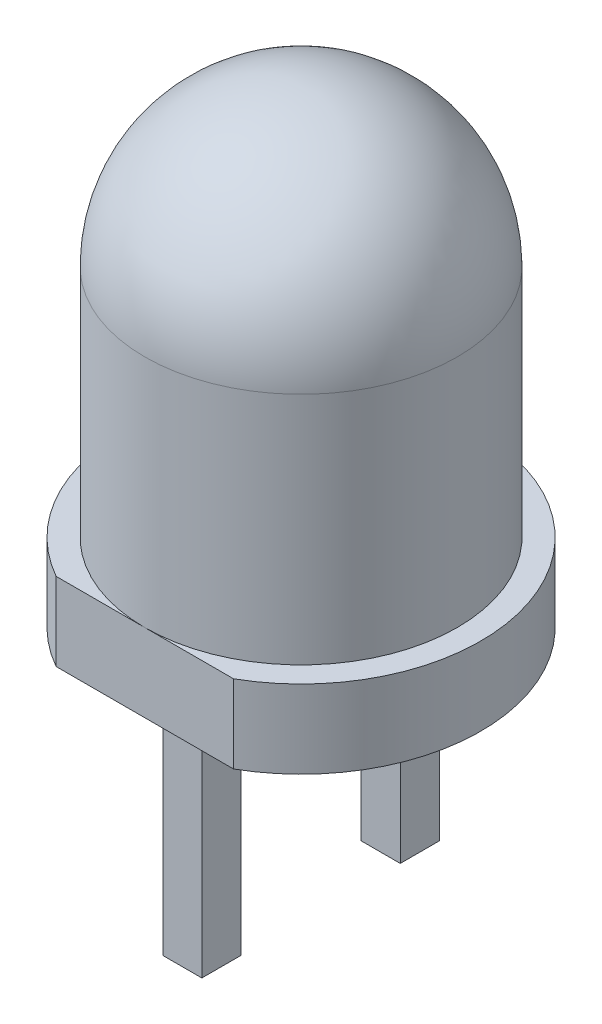
ISO-10303-21;
HEADER;
FILE_DESCRIPTION(('STEP AP214'),'2;1');
FILE_NAME('part.step','',(''),(''),'','','');
FILE_SCHEMA(('AUTOMOTIVE_DESIGN { 1 0 10303 214 1 1 1 1 }'));
ENDSEC;
DATA;
#1=APPLICATION_CONTEXT('core data for automotive mechanical design processes');
#2=APPLICATION_PROTOCOL_DEFINITION('international standard','automotive_design',2000,#1);
#3=PRODUCT_CONTEXT('',#1,'mechanical');
#4=PRODUCT('Part','Part','',(#3));
#5=PRODUCT_RELATED_PRODUCT_CATEGORY('part','',(#4));
#6=PRODUCT_DEFINITION_FORMATION('','',#4);
#7=PRODUCT_DEFINITION_CONTEXT('part definition',#1,'design');
#8=PRODUCT_DEFINITION('design','',#6,#7);
#9=PRODUCT_DEFINITION_SHAPE('','',#8);
#10=(LENGTH_UNIT() NAMED_UNIT(*) SI_UNIT(.MILLI.,.METRE.));
#11=(NAMED_UNIT(*) PLANE_ANGLE_UNIT() SI_UNIT($,.RADIAN.));
#12=(NAMED_UNIT(*) SI_UNIT($,.STERADIAN.) SOLID_ANGLE_UNIT());
#13=UNCERTAINTY_MEASURE_WITH_UNIT(LENGTH_MEASURE(1.E-05),#10,'distance_accuracy_value','');
#14=(GEOMETRIC_REPRESENTATION_CONTEXT(3) GLOBAL_UNCERTAINTY_ASSIGNED_CONTEXT((#13)) GLOBAL_UNIT_ASSIGNED_CONTEXT((#10,
#11,#12)) REPRESENTATION_CONTEXT('',''));
#15=CARTESIAN_POINT('',(0.,0.,0.));
#16=DIRECTION('',(0.,0.,1.));
#17=DIRECTION('',(1.,0.,0.));
#18=AXIS2_PLACEMENT_3D('',#15,#16,#17);
#19=CARTESIAN_POINT('',(0.,0.,0.));
#20=DIRECTION('',(0.,1.,0.));
#21=DIRECTION('',(0.,0.,1.));
#22=AXIS2_PLACEMENT_3D('',#19,#20,#21);
#23=PLANE('',#22);
#24=DIRECTION('',(0.,0.,1.));
#25=VECTOR('',#24,1.);
#26=CARTESIAN_POINT('',(0.25,0.,1.02));
#27=LINE('',#26,#25);
#28=CARTESIAN_POINT('',(0.25,0.,1.02));
#29=VERTEX_POINT('',#28);
#30=CARTESIAN_POINT('',(0.25,0.,1.52));
#31=VERTEX_POINT('',#30);
#32=EDGE_CURVE('E166',#29,#31,#27,.T.);
#33=ORIENTED_EDGE('',*,*,#32,.F.);
#34=DIRECTION('',(-1.,0.,0.));
#35=VECTOR('',#34,1.);
#36=CARTESIAN_POINT('',(0.25,0.,1.02));
#37=LINE('',#36,#35);
#38=CARTESIAN_POINT('',(-0.25,0.,1.02));
#39=VERTEX_POINT('',#38);
#40=EDGE_CURVE('E157',#29,#39,#37,.T.);
#41=ORIENTED_EDGE('',*,*,#40,.T.);
#42=DIRECTION('',(0.,0.,1.));
#43=VECTOR('',#42,1.);
#44=CARTESIAN_POINT('',(-0.25,0.,1.02));
#45=LINE('',#44,#43);
#46=CARTESIAN_POINT('',(-0.25,0.,1.52));
#47=VERTEX_POINT('',#46);
#48=EDGE_CURVE('E161',#39,#47,#45,.T.);
#49=ORIENTED_EDGE('',*,*,#48,.T.);
#50=DIRECTION('',(-1.,0.,0.));
#51=VECTOR('',#50,1.);
#52=CARTESIAN_POINT('',(0.25,0.,1.52));
#53=LINE('',#52,#51);
#54=EDGE_CURVE('E164',#31,#47,#53,.T.);
#55=ORIENTED_EDGE('',*,*,#54,.F.);
#56=EDGE_LOOP('',(#33,#41,#49,#55));
#57=FACE_BOUND('',#56,.T.);
#58=DIRECTION('',(-1.,0.,0.));
#59=VECTOR('',#58,1.);
#60=CARTESIAN_POINT('',(0.25,0.,-1.02));
#61=LINE('',#60,#59);
#62=CARTESIAN_POINT('',(0.25,0.,-1.02));
#63=VERTEX_POINT('',#62);
#64=CARTESIAN_POINT('',(-0.25,0.,-1.02));
#65=VERTEX_POINT('',#64);
#66=EDGE_CURVE('E190',#63,#65,#61,.T.);
#67=ORIENTED_EDGE('',*,*,#66,.F.);
#68=DIRECTION('',(0.,0.,-1.));
#69=VECTOR('',#68,1.);
#70=CARTESIAN_POINT('',(0.25,0.,-1.02));
#71=LINE('',#70,#69);
#72=CARTESIAN_POINT('',(0.25,0.,-1.52));
#73=VERTEX_POINT('',#72);
#74=EDGE_CURVE('E129',#63,#73,#71,.T.);
#75=ORIENTED_EDGE('',*,*,#74,.T.);
#76=DIRECTION('',(-1.,0.,0.));
#77=VECTOR('',#76,1.);
#78=CARTESIAN_POINT('',(0.25,0.,-1.52));
#79=LINE('',#78,#77);
#80=CARTESIAN_POINT('',(-0.25,0.,-1.52));
#81=VERTEX_POINT('',#80);
#82=EDGE_CURVE('E185',#73,#81,#79,.T.);
#83=ORIENTED_EDGE('',*,*,#82,.T.);
#84=DIRECTION('',(0.,0.,-1.));
#85=VECTOR('',#84,1.);
#86=CARTESIAN_POINT('',(-0.25,0.,-1.02));
#87=LINE('',#86,#85);
#88=EDGE_CURVE('E60',#65,#81,#87,.T.);
#89=ORIENTED_EDGE('',*,*,#88,.F.);
#90=EDGE_LOOP('',(#67,#75,#83,#89));
#91=FACE_BOUND('',#90,.T.);
#92=DIRECTION('',(1.,0.,0.));
#93=VECTOR('',#92,1.);
#94=CARTESIAN_POINT('',(0.,0.,2.));
#95=LINE('',#94,#93);
#96=CARTESIAN_POINT('',(-1.13578166916005,0.,2.));
#97=VERTEX_POINT('',#96);
#98=CARTESIAN_POINT('',(1.13578166916005,0.,2.));
#99=VERTEX_POINT('',#98);
#100=EDGE_CURVE('E203',#97,#99,#95,.T.);
#101=ORIENTED_EDGE('',*,*,#100,.F.);
#102=CARTESIAN_POINT('',(0.,0.,0.));
#103=DIRECTION('',(0.,1.,0.));
#104=DIRECTION('',(0.,0.,1.));
#105=AXIS2_PLACEMENT_3D('',#102,#103,#104);
#106=CIRCLE('',#105,2.3);
#107=EDGE_CURVE('E134',#99,#97,#106,.T.);
#108=ORIENTED_EDGE('',*,*,#107,.F.);
#109=EDGE_LOOP('',(#101,#108));
#110=FACE_BOUND('',#109,.T.);
#111=ADVANCED_FACE('F37',(#57,#91,#110),#23,.F.);
#112=CARTESIAN_POINT('',(0.,1.,0.));
#113=DIRECTION('',(0.,-1.,0.));
#114=DIRECTION('',(0.,0.,-1.));
#115=AXIS2_PLACEMENT_3D('',#112,#113,#114);
#116=CYLINDRICAL_SURFACE('',#115,2.3);
#117=DIRECTION('',(0.,-1.,0.));
#118=VECTOR('',#117,1.);
#119=CARTESIAN_POINT('',(-1.13578166916005,1.,2.));
#120=LINE('',#119,#118);
#121=CARTESIAN_POINT('',(-1.13578166916005,1.,2.));
#122=VERTEX_POINT('',#121);
#123=EDGE_CURVE('E130',#122,#97,#120,.T.);
#124=ORIENTED_EDGE('',*,*,#123,.F.);
#125=CARTESIAN_POINT('',(0.,1.,0.));
#126=DIRECTION('',(0.,1.,0.));
#127=DIRECTION('',(0.,0.,1.));
#128=AXIS2_PLACEMENT_3D('',#125,#126,#127);
#129=CIRCLE('',#128,2.3);
#130=CARTESIAN_POINT('',(1.13578166916005,1.,2.));
#131=VERTEX_POINT('',#130);
#132=EDGE_CURVE('E128',#131,#122,#129,.T.);
#133=ORIENTED_EDGE('',*,*,#132,.F.);
#134=DIRECTION('',(0.,-1.,0.));
#135=VECTOR('',#134,1.);
#136=CARTESIAN_POINT('',(1.13578166916005,1.,2.));
#137=LINE('',#136,#135);
#138=EDGE_CURVE('E52',#99,#131,#137,.F.);
#139=ORIENTED_EDGE('',*,*,#138,.F.);
#140=ORIENTED_EDGE('',*,*,#107,.T.);
#141=EDGE_LOOP('',(#124,#133,#139,#140));
#142=FACE_BOUND('',#141,.T.);
#143=ADVANCED_FACE('F207',(#142),#116,.T.);
#144=CARTESIAN_POINT('',(0.,1.,0.));
#145=DIRECTION('',(0.,1.,0.));
#146=DIRECTION('',(0.,0.,1.));
#147=AXIS2_PLACEMENT_3D('',#144,#145,#146);
#148=PLANE('',#147);
#149=ORIENTED_EDGE('',*,*,#132,.T.);
#150=DIRECTION('',(1.,0.,0.));
#151=VECTOR('',#150,1.);
#152=CARTESIAN_POINT('',(0.,1.,2.));
#153=LINE('',#152,#151);
#154=CARTESIAN_POINT('',(0.,1.,2.));
#155=VERTEX_POINT('',#154);
#156=EDGE_CURVE('E119',#122,#155,#153,.T.);
#157=ORIENTED_EDGE('',*,*,#156,.T.);
#158=CARTESIAN_POINT('',(0.,1.,0.));
#159=DIRECTION('',(0.,1.,0.));
#160=DIRECTION('',(0.,0.,1.));
#161=AXIS2_PLACEMENT_3D('',#158,#159,#160);
#162=CIRCLE('',#161,2.);
#163=EDGE_CURVE('E45',#155,#155,#162,.T.);
#164=ORIENTED_EDGE('',*,*,#163,.F.);
#165=EDGE_CURVE('E116',#155,#131,#153,.T.);
#166=ORIENTED_EDGE('',*,*,#165,.T.);
#167=EDGE_LOOP('',(#149,#157,#164,#166));
#168=FACE_BOUND('',#167,.T.);
#169=ADVANCED_FACE('F127',(#168),#148,.T.);
#170=CARTESIAN_POINT('',(0.,6.,0.));
#171=DIRECTION('',(0.,-1.,0.));
#172=DIRECTION('',(0.,0.,-1.));
#173=AXIS2_PLACEMENT_3D('',#170,#171,#172);
#174=CYLINDRICAL_SURFACE('',#173,2.);
#175=CARTESIAN_POINT('',(0.,4.,0.));
#176=DIRECTION('',(0.,-1.,0.));
#177=DIRECTION('',(0.,0.,-1.));
#178=AXIS2_PLACEMENT_3D('',#175,#176,#177);
#179=CIRCLE('',#178,2.);
#180=CARTESIAN_POINT('',(0.,4.,-2.));
#181=VERTEX_POINT('',#180);
#182=EDGE_CURVE('E11',#181,#181,#179,.T.);
#183=ORIENTED_EDGE('',*,*,#182,.T.);
#184=EDGE_LOOP('',(#183));
#185=FACE_BOUND('',#184,.T.);
#186=ORIENTED_EDGE('',*,*,#163,.T.);
#187=EDGE_LOOP('',(#186));
#188=FACE_BOUND('',#187,.T.);
#189=ADVANCED_FACE('F132',(#185,#188),#174,.T.);
#190=CARTESIAN_POINT('',(0.25,-3.,1.02));
#191=DIRECTION('',(-1.,0.,0.));
#192=DIRECTION('',(0.,0.,1.));
#193=AXIS2_PLACEMENT_3D('',#190,#191,#192);
#194=PLANE('',#193);
#195=ORIENTED_EDGE('',*,*,#32,.T.);
#196=DIRECTION('',(0.,1.,0.));
#197=VECTOR('',#196,1.);
#198=CARTESIAN_POINT('',(0.25,-3.,1.52));
#199=LINE('',#198,#197);
#200=CARTESIAN_POINT('',(0.25,-3.,1.52));
#201=VERTEX_POINT('',#200);
#202=EDGE_CURVE('E137',#201,#31,#199,.T.);
#203=ORIENTED_EDGE('',*,*,#202,.F.);
#204=DIRECTION('',(0.,0.,1.));
#205=VECTOR('',#204,1.);
#206=CARTESIAN_POINT('',(0.25,-3.,1.02));
#207=LINE('',#206,#205);
#208=CARTESIAN_POINT('',(0.25,-3.,1.02));
#209=VERTEX_POINT('',#208);
#210=EDGE_CURVE('E160',#209,#201,#207,.T.);
#211=ORIENTED_EDGE('',*,*,#210,.F.);
#212=DIRECTION('',(0.,1.,0.));
#213=VECTOR('',#212,1.);
#214=CARTESIAN_POINT('',(0.25,-3.,1.02));
#215=LINE('',#214,#213);
#216=EDGE_CURVE('E152',#209,#29,#215,.T.);
#217=ORIENTED_EDGE('',*,*,#216,.T.);
#218=EDGE_LOOP('',(#195,#203,#211,#217));
#219=FACE_BOUND('',#218,.T.);
#220=ADVANCED_FACE('F221',(#219),#194,.F.);
#221=CARTESIAN_POINT('',(0.25,-3.,1.52));
#222=DIRECTION('',(0.,0.,-1.));
#223=DIRECTION('',(-1.,0.,0.));
#224=AXIS2_PLACEMENT_3D('',#221,#222,#223);
#225=PLANE('',#224);
#226=ORIENTED_EDGE('',*,*,#54,.T.);
#227=DIRECTION('',(0.,1.,0.));
#228=VECTOR('',#227,1.);
#229=CARTESIAN_POINT('',(-0.25,-3.,1.52));
#230=LINE('',#229,#228);
#231=CARTESIAN_POINT('',(-0.25,-3.,1.52));
#232=VERTEX_POINT('',#231);
#233=EDGE_CURVE('E142',#232,#47,#230,.T.);
#234=ORIENTED_EDGE('',*,*,#233,.F.);
#235=DIRECTION('',(-1.,0.,0.));
#236=VECTOR('',#235,1.);
#237=CARTESIAN_POINT('',(0.25,-3.,1.52));
#238=LINE('',#237,#236);
#239=EDGE_CURVE('E173',#201,#232,#238,.T.);
#240=ORIENTED_EDGE('',*,*,#239,.F.);
#241=ORIENTED_EDGE('',*,*,#202,.T.);
#242=EDGE_LOOP('',(#226,#234,#240,#241));
#243=FACE_BOUND('',#242,.T.);
#244=ADVANCED_FACE('F225',(#243),#225,.F.);
#245=CARTESIAN_POINT('',(-0.25,-3.,1.02));
#246=DIRECTION('',(-1.,0.,0.));
#247=DIRECTION('',(0.,0.,1.));
#248=AXIS2_PLACEMENT_3D('',#245,#246,#247);
#249=PLANE('',#248);
#250=ORIENTED_EDGE('',*,*,#48,.F.);
#251=DIRECTION('',(0.,1.,0.));
#252=VECTOR('',#251,1.);
#253=CARTESIAN_POINT('',(-0.25,-3.,1.02));
#254=LINE('',#253,#252);
#255=CARTESIAN_POINT('',(-0.25,-3.,1.02));
#256=VERTEX_POINT('',#255);
#257=EDGE_CURVE('E147',#256,#39,#254,.T.);
#258=ORIENTED_EDGE('',*,*,#257,.F.);
#259=DIRECTION('',(0.,0.,1.));
#260=VECTOR('',#259,1.);
#261=CARTESIAN_POINT('',(-0.25,-3.,1.02));
#262=LINE('',#261,#260);
#263=EDGE_CURVE('E171',#256,#232,#262,.T.);
#264=ORIENTED_EDGE('',*,*,#263,.T.);
#265=ORIENTED_EDGE('',*,*,#233,.T.);
#266=EDGE_LOOP('',(#250,#258,#264,#265));
#267=FACE_BOUND('',#266,.T.);
#268=ADVANCED_FACE('F229',(#267),#249,.T.);
#269=CARTESIAN_POINT('',(0.25,-3.,1.02));
#270=DIRECTION('',(0.,0.,-1.));
#271=DIRECTION('',(-1.,0.,0.));
#272=AXIS2_PLACEMENT_3D('',#269,#270,#271);
#273=PLANE('',#272);
#274=ORIENTED_EDGE('',*,*,#40,.F.);
#275=ORIENTED_EDGE('',*,*,#216,.F.);
#276=DIRECTION('',(-1.,0.,0.));
#277=VECTOR('',#276,1.);
#278=CARTESIAN_POINT('',(0.25,-3.,1.02));
#279=LINE('',#278,#277);
#280=EDGE_CURVE('E156',#209,#256,#279,.T.);
#281=ORIENTED_EDGE('',*,*,#280,.T.);
#282=ORIENTED_EDGE('',*,*,#257,.T.);
#283=EDGE_LOOP('',(#274,#275,#281,#282));
#284=FACE_BOUND('',#283,.T.);
#285=ADVANCED_FACE('F232',(#284),#273,.T.);
#286=CARTESIAN_POINT('',(0.,-3.,0.));
#287=DIRECTION('',(0.,-1.,0.));
#288=DIRECTION('',(0.,0.,-1.));
#289=AXIS2_PLACEMENT_3D('',#286,#287,#288);
#290=PLANE('',#289);
#291=ORIENTED_EDGE('',*,*,#210,.T.);
#292=ORIENTED_EDGE('',*,*,#239,.T.);
#293=ORIENTED_EDGE('',*,*,#263,.F.);
#294=ORIENTED_EDGE('',*,*,#280,.F.);
#295=EDGE_LOOP('',(#291,#292,#293,#294));
#296=FACE_BOUND('',#295,.T.);
#297=ADVANCED_FACE('F235',(#296),#290,.T.);
#298=CARTESIAN_POINT('',(0.25,-3.,-1.02));
#299=DIRECTION('',(1.,0.,0.));
#300=DIRECTION('',(0.,0.,-1.));
#301=AXIS2_PLACEMENT_3D('',#298,#299,#300);
#302=PLANE('',#301);
#303=ORIENTED_EDGE('',*,*,#74,.F.);
#304=DIRECTION('',(0.,1.,0.));
#305=VECTOR('',#304,1.);
#306=CARTESIAN_POINT('',(0.25,-3.,-1.02));
#307=LINE('',#306,#305);
#308=CARTESIAN_POINT('',(0.25,-3.,-1.02));
#309=VERTEX_POINT('',#308);
#310=EDGE_CURVE('E168',#309,#63,#307,.T.);
#311=ORIENTED_EDGE('',*,*,#310,.F.);
#312=DIRECTION('',(0.,0.,-1.));
#313=VECTOR('',#312,1.);
#314=CARTESIAN_POINT('',(0.25,-3.,-1.02));
#315=LINE('',#314,#313);
#316=CARTESIAN_POINT('',(0.25,-3.,-1.52));
#317=VERTEX_POINT('',#316);
#318=EDGE_CURVE('E188',#309,#317,#315,.T.);
#319=ORIENTED_EDGE('',*,*,#318,.T.);
#320=DIRECTION('',(0.,1.,0.));
#321=VECTOR('',#320,1.);
#322=CARTESIAN_POINT('',(0.25,-3.,-1.52));
#323=LINE('',#322,#321);
#324=EDGE_CURVE('E182',#317,#73,#323,.T.);
#325=ORIENTED_EDGE('',*,*,#324,.T.);
#326=EDGE_LOOP('',(#303,#311,#319,#325));
#327=FACE_BOUND('',#326,.T.);
#328=ADVANCED_FACE('F239',(#327),#302,.T.);
#329=CARTESIAN_POINT('',(0.25,-3.,-1.02));
#330=DIRECTION('',(0.,0.,-1.));
#331=DIRECTION('',(-1.,0.,0.));
#332=AXIS2_PLACEMENT_3D('',#329,#330,#331);
#333=PLANE('',#332);
#334=ORIENTED_EDGE('',*,*,#66,.T.);
#335=DIRECTION('',(0.,1.,0.));
#336=VECTOR('',#335,1.);
#337=CARTESIAN_POINT('',(-0.25,-3.,-1.02));
#338=LINE('',#337,#336);
#339=CARTESIAN_POINT('',(-0.25,-3.,-1.02));
#340=VERTEX_POINT('',#339);
#341=EDGE_CURVE('E178',#340,#65,#338,.T.);
#342=ORIENTED_EDGE('',*,*,#341,.F.);
#343=DIRECTION('',(-1.,0.,0.));
#344=VECTOR('',#343,1.);
#345=CARTESIAN_POINT('',(0.25,-3.,-1.02));
#346=LINE('',#345,#344);
#347=EDGE_CURVE('E198',#309,#340,#346,.T.);
#348=ORIENTED_EDGE('',*,*,#347,.F.);
#349=ORIENTED_EDGE('',*,*,#310,.T.);
#350=EDGE_LOOP('',(#334,#342,#348,#349));
#351=FACE_BOUND('',#350,.T.);
#352=ADVANCED_FACE('F243',(#351),#333,.F.);
#353=CARTESIAN_POINT('',(-0.25,-3.,-1.02));
#354=DIRECTION('',(1.,0.,0.));
#355=DIRECTION('',(0.,0.,-1.));
#356=AXIS2_PLACEMENT_3D('',#353,#354,#355);
#357=PLANE('',#356);
#358=ORIENTED_EDGE('',*,*,#88,.T.);
#359=DIRECTION('',(0.,1.,0.));
#360=VECTOR('',#359,1.);
#361=CARTESIAN_POINT('',(-0.25,-3.,-1.52));
#362=LINE('',#361,#360);
#363=CARTESIAN_POINT('',(-0.25,-3.,-1.52));
#364=VERTEX_POINT('',#363);
#365=EDGE_CURVE('E180',#364,#81,#362,.T.);
#366=ORIENTED_EDGE('',*,*,#365,.F.);
#367=DIRECTION('',(0.,0.,-1.));
#368=VECTOR('',#367,1.);
#369=CARTESIAN_POINT('',(-0.25,-3.,-1.02));
#370=LINE('',#369,#368);
#371=EDGE_CURVE('E196',#340,#364,#370,.T.);
#372=ORIENTED_EDGE('',*,*,#371,.F.);
#373=ORIENTED_EDGE('',*,*,#341,.T.);
#374=EDGE_LOOP('',(#358,#366,#372,#373));
#375=FACE_BOUND('',#374,.T.);
#376=ADVANCED_FACE('F247',(#375),#357,.F.);
#377=CARTESIAN_POINT('',(0.25,-3.,-1.52));
#378=DIRECTION('',(0.,0.,-1.));
#379=DIRECTION('',(-1.,0.,0.));
#380=AXIS2_PLACEMENT_3D('',#377,#378,#379);
#381=PLANE('',#380);
#382=ORIENTED_EDGE('',*,*,#82,.F.);
#383=ORIENTED_EDGE('',*,*,#324,.F.);
#384=DIRECTION('',(-1.,0.,0.));
#385=VECTOR('',#384,1.);
#386=CARTESIAN_POINT('',(0.25,-3.,-1.52));
#387=LINE('',#386,#385);
#388=EDGE_CURVE('E184',#317,#364,#387,.T.);
#389=ORIENTED_EDGE('',*,*,#388,.T.);
#390=ORIENTED_EDGE('',*,*,#365,.T.);
#391=EDGE_LOOP('',(#382,#383,#389,#390));
#392=FACE_BOUND('',#391,.T.);
#393=ADVANCED_FACE('F251',(#392),#381,.T.);
#394=CARTESIAN_POINT('',(0.,-3.,0.));
#395=DIRECTION('',(0.,-1.,0.));
#396=DIRECTION('',(0.,0.,1.));
#397=AXIS2_PLACEMENT_3D('',#394,#395,#396);
#398=PLANE('',#397);
#399=ORIENTED_EDGE('',*,*,#318,.F.);
#400=ORIENTED_EDGE('',*,*,#347,.T.);
#401=ORIENTED_EDGE('',*,*,#371,.T.);
#402=ORIENTED_EDGE('',*,*,#388,.F.);
#403=EDGE_LOOP('',(#399,#400,#401,#402));
#404=FACE_BOUND('',#403,.T.);
#405=ADVANCED_FACE('F254',(#404),#398,.T.);
#406=CARTESIAN_POINT('',(0.,0.,2.));
#407=DIRECTION('',(0.,0.,1.));
#408=DIRECTION('',(1.,0.,0.));
#409=AXIS2_PLACEMENT_3D('',#406,#407,#408);
#410=PLANE('',#409);
#411=ORIENTED_EDGE('',*,*,#123,.T.);
#412=ORIENTED_EDGE('',*,*,#100,.T.);
#413=ORIENTED_EDGE('',*,*,#138,.T.);
#414=ORIENTED_EDGE('',*,*,#165,.F.);
#415=ORIENTED_EDGE('',*,*,#156,.F.);
#416=EDGE_LOOP('',(#411,#412,#413,#414,#415));
#417=FACE_BOUND('',#416,.T.);
#418=ADVANCED_FACE('F118',(#417),#410,.T.);
#419=CARTESIAN_POINT('',(0.,4.,0.));
#420=DIRECTION('',(0.,1.,0.));
#421=DIRECTION('',(0.,0.,1.));
#422=AXIS2_PLACEMENT_3D('',#419,#420,#421);
#423=SPHERICAL_SURFACE('',#422,2.);
#424=ORIENTED_EDGE('',*,*,#182,.F.);
#425=EDGE_LOOP('',(#424));
#426=FACE_BOUND('',#425,.T.);
#427=ADVANCED_FACE('F39',(#426),#423,.T.);
#428=CLOSED_SHELL('',(#111,#143,#169,#189,#220,#244,#268,#285,#297,#328,#352,#376,#393,#405,
#418,#427));
#429=MANIFOLD_SOLID_BREP('B2',#428);
#430=ADVANCED_BREP_SHAPE_REPRESENTATION('',(#18,#429),#14);
#431=SHAPE_DEFINITION_REPRESENTATION(#9,#430);
ENDSEC;
END-ISO-10303-21;
